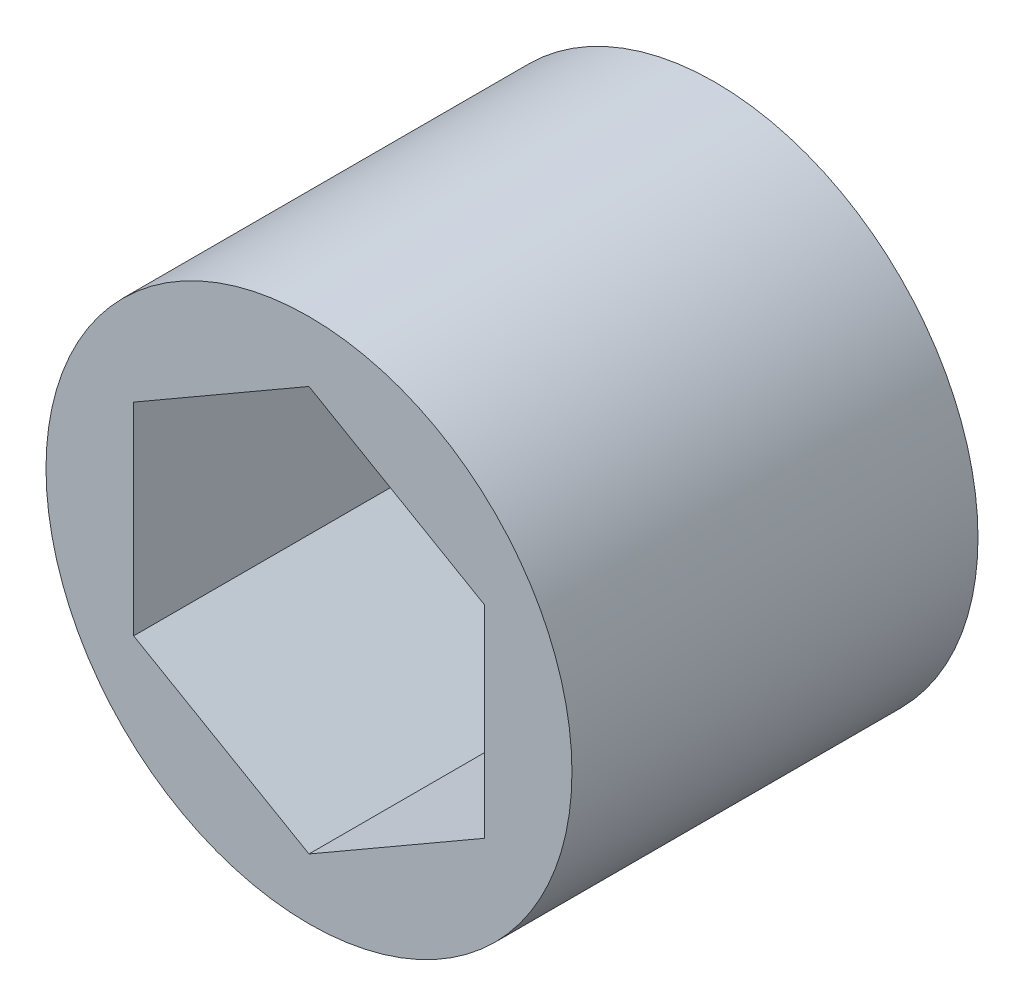
ISO-10303-21;
HEADER;
FILE_DESCRIPTION(('STEP AP214'),'2;1');
FILE_NAME('part.step','',(''),(''),'','','');
FILE_SCHEMA(('AUTOMOTIVE_DESIGN { 1 0 10303 214 1 1 1 1 }'));
ENDSEC;
DATA;
#1=APPLICATION_CONTEXT('core data for automotive mechanical design processes');
#2=APPLICATION_PROTOCOL_DEFINITION('international standard','automotive_design',2000,#1);
#3=PRODUCT_CONTEXT('',#1,'mechanical');
#4=PRODUCT('Part','Part','',(#3));
#5=PRODUCT_RELATED_PRODUCT_CATEGORY('part','',(#4));
#6=PRODUCT_DEFINITION_FORMATION('','',#4);
#7=PRODUCT_DEFINITION_CONTEXT('part definition',#1,'design');
#8=PRODUCT_DEFINITION('design','',#6,#7);
#9=PRODUCT_DEFINITION_SHAPE('','',#8);
#10=(LENGTH_UNIT() NAMED_UNIT(*) SI_UNIT(.MILLI.,.METRE.));
#11=(NAMED_UNIT(*) PLANE_ANGLE_UNIT() SI_UNIT($,.RADIAN.));
#12=(NAMED_UNIT(*) SI_UNIT($,.STERADIAN.) SOLID_ANGLE_UNIT());
#13=UNCERTAINTY_MEASURE_WITH_UNIT(LENGTH_MEASURE(1.E-05),#10,'distance_accuracy_value','');
#14=(GEOMETRIC_REPRESENTATION_CONTEXT(3) GLOBAL_UNCERTAINTY_ASSIGNED_CONTEXT((#13)) GLOBAL_UNIT_ASSIGNED_CONTEXT((#10,
#11,#12)) REPRESENTATION_CONTEXT('',''));
#15=CARTESIAN_POINT('',(0.,0.,0.));
#16=DIRECTION('',(0.,0.,1.));
#17=DIRECTION('',(1.,0.,0.));
#18=AXIS2_PLACEMENT_3D('',#15,#16,#17);
#19=CARTESIAN_POINT('',(0.,0.,7.3533));
#20=DIRECTION('',(0.,0.,1.));
#21=DIRECTION('',(1.,0.,0.));
#22=AXIS2_PLACEMENT_3D('',#19,#20,#21);
#23=PLANE('',#22);
#24=CARTESIAN_POINT('',(0.,0.,7.3533));
#25=DIRECTION('',(0.,0.,1.));
#26=DIRECTION('',(1.,0.,0.));
#27=AXIS2_PLACEMENT_3D('',#24,#25,#26);
#28=CIRCLE('',#27,9.525);
#29=CARTESIAN_POINT('',(-9.525,0.,7.3533));
#30=VERTEX_POINT('',#29);
#31=EDGE_CURVE('E11',#30,#30,#28,.T.);
#32=ORIENTED_EDGE('',*,*,#31,.T.);
#33=EDGE_LOOP('',(#32));
#34=FACE_BOUND('',#33,.T.);
#35=DIRECTION('',(-0.866025403784439,-0.5,0.));
#36=VECTOR('',#35,1.);
#37=CARTESIAN_POINT('',(0.,7.33234841870824,7.3533));
#38=LINE('',#37,#36);
#39=CARTESIAN_POINT('',(0.,7.33234841870824,7.3533));
#40=VERTEX_POINT('',#39);
#41=CARTESIAN_POINT('',(-6.35,3.66617420935412,7.3533));
#42=VERTEX_POINT('',#41);
#43=EDGE_CURVE('E104',#40,#42,#38,.T.);
#44=ORIENTED_EDGE('',*,*,#43,.F.);
#45=DIRECTION('',(-0.866025403784439,0.5,0.));
#46=VECTOR('',#45,1.);
#47=CARTESIAN_POINT('',(6.35,3.66617420935412,7.3533));
#48=LINE('',#47,#46);
#49=CARTESIAN_POINT('',(6.35,3.66617420935412,7.3533));
#50=VERTEX_POINT('',#49);
#51=EDGE_CURVE('E96',#50,#40,#48,.T.);
#52=ORIENTED_EDGE('',*,*,#51,.F.);
#53=DIRECTION('',(0.,1.,0.));
#54=VECTOR('',#53,1.);
#55=CARTESIAN_POINT('',(6.35,-3.66617420935413,7.3533));
#56=LINE('',#55,#54);
#57=CARTESIAN_POINT('',(6.35,-3.66617420935413,7.3533));
#58=VERTEX_POINT('',#57);
#59=EDGE_CURVE('E124',#58,#50,#56,.T.);
#60=ORIENTED_EDGE('',*,*,#59,.F.);
#61=DIRECTION('',(0.866025403784439,0.5,0.));
#62=VECTOR('',#61,1.);
#63=CARTESIAN_POINT('',(0.,-7.33234841870825,7.3533));
#64=LINE('',#63,#62);
#65=CARTESIAN_POINT('',(0.,-7.33234841870825,7.3533));
#66=VERTEX_POINT('',#65);
#67=EDGE_CURVE('E122',#66,#58,#64,.T.);
#68=ORIENTED_EDGE('',*,*,#67,.F.);
#69=DIRECTION('',(0.866025403784439,-0.5,0.));
#70=VECTOR('',#69,1.);
#71=CARTESIAN_POINT('',(-6.35,-3.66617420935412,7.3533));
#72=LINE('',#71,#70);
#73=CARTESIAN_POINT('',(-6.35,-3.66617420935412,7.3533));
#74=VERTEX_POINT('',#73);
#75=EDGE_CURVE('E118',#74,#66,#72,.T.);
#76=ORIENTED_EDGE('',*,*,#75,.F.);
#77=DIRECTION('',(0.,-1.,0.));
#78=VECTOR('',#77,1.);
#79=CARTESIAN_POINT('',(-6.35,3.66617420935412,7.3533));
#80=LINE('',#79,#78);
#81=EDGE_CURVE('E116',#42,#74,#80,.T.);
#82=ORIENTED_EDGE('',*,*,#81,.F.);
#83=EDGE_LOOP('',(#44,#52,#60,#68,#76,#82));
#84=FACE_BOUND('',#83,.T.);
#85=ADVANCED_FACE('F43',(#34,#84),#23,.T.);
#86=CARTESIAN_POINT('',(0.,0.,-7.3533));
#87=DIRECTION('',(0.,0.,1.));
#88=DIRECTION('',(1.,0.,0.));
#89=AXIS2_PLACEMENT_3D('',#86,#87,#88);
#90=PLANE('',#89);
#91=CARTESIAN_POINT('',(0.,0.,-7.3533));
#92=DIRECTION('',(0.,0.,1.));
#93=DIRECTION('',(1.,0.,0.));
#94=AXIS2_PLACEMENT_3D('',#91,#92,#93);
#95=CIRCLE('',#94,9.525);
#96=CARTESIAN_POINT('',(-9.525,0.,-7.3533));
#97=VERTEX_POINT('',#96);
#98=EDGE_CURVE('E47',#97,#97,#95,.T.);
#99=ORIENTED_EDGE('',*,*,#98,.F.);
#100=EDGE_LOOP('',(#99));
#101=FACE_BOUND('',#100,.T.);
#102=DIRECTION('',(-0.866025403784439,0.5,0.));
#103=VECTOR('',#102,1.);
#104=CARTESIAN_POINT('',(6.35,3.66617420935412,-7.3533));
#105=LINE('',#104,#103);
#106=CARTESIAN_POINT('',(6.35,3.66617420935412,-7.3533));
#107=VERTEX_POINT('',#106);
#108=CARTESIAN_POINT('',(0.,7.33234841870824,-7.3533));
#109=VERTEX_POINT('',#108);
#110=EDGE_CURVE('E66',#107,#109,#105,.T.);
#111=ORIENTED_EDGE('',*,*,#110,.T.);
#112=DIRECTION('',(-0.866025403784439,-0.5,0.));
#113=VECTOR('',#112,1.);
#114=CARTESIAN_POINT('',(0.,7.33234841870824,-7.3533));
#115=LINE('',#114,#113);
#116=CARTESIAN_POINT('',(-6.35,3.66617420935412,-7.3533));
#117=VERTEX_POINT('',#116);
#118=EDGE_CURVE('E111',#109,#117,#115,.T.);
#119=ORIENTED_EDGE('',*,*,#118,.T.);
#120=DIRECTION('',(0.,-1.,0.));
#121=VECTOR('',#120,1.);
#122=CARTESIAN_POINT('',(-6.35,3.66617420935412,-7.3533));
#123=LINE('',#122,#121);
#124=CARTESIAN_POINT('',(-6.35,-3.66617420935412,-7.3533));
#125=VERTEX_POINT('',#124);
#126=EDGE_CURVE('E128',#117,#125,#123,.T.);
#127=ORIENTED_EDGE('',*,*,#126,.T.);
#128=DIRECTION('',(0.866025403784439,-0.5,0.));
#129=VECTOR('',#128,1.);
#130=CARTESIAN_POINT('',(-6.35,-3.66617420935412,-7.3533));
#131=LINE('',#130,#129);
#132=CARTESIAN_POINT('',(0.,-7.33234841870825,-7.3533));
#133=VERTEX_POINT('',#132);
#134=EDGE_CURVE('E131',#125,#133,#131,.T.);
#135=ORIENTED_EDGE('',*,*,#134,.T.);
#136=DIRECTION('',(0.866025403784439,0.5,0.));
#137=VECTOR('',#136,1.);
#138=CARTESIAN_POINT('',(0.,-7.33234841870825,-7.3533));
#139=LINE('',#138,#137);
#140=CARTESIAN_POINT('',(6.35,-3.66617420935413,-7.3533));
#141=VERTEX_POINT('',#140);
#142=EDGE_CURVE('E134',#133,#141,#139,.T.);
#143=ORIENTED_EDGE('',*,*,#142,.T.);
#144=DIRECTION('',(0.,1.,0.));
#145=VECTOR('',#144,1.);
#146=CARTESIAN_POINT('',(6.35,-3.66617420935413,-7.3533));
#147=LINE('',#146,#145);
#148=EDGE_CURVE('E105',#141,#107,#147,.T.);
#149=ORIENTED_EDGE('',*,*,#148,.T.);
#150=EDGE_LOOP('',(#111,#119,#127,#135,#143,#149));
#151=FACE_BOUND('',#150,.T.);
#152=ADVANCED_FACE('F151',(#101,#151),#90,.F.);
#153=CARTESIAN_POINT('',(0.,0.,7.3533));
#154=DIRECTION('',(0.,0.,-1.));
#155=DIRECTION('',(-1.,0.,0.));
#156=AXIS2_PLACEMENT_3D('',#153,#154,#155);
#157=CYLINDRICAL_SURFACE('',#156,9.525);
#158=CARTESIAN_POINT('',(-9.525,0.,7.3533));
#159=CARTESIAN_POINT('',(-9.525,0.,7.20010625));
#160=CARTESIAN_POINT('',(-9.525,0.,7.0469125));
#161=CARTESIAN_POINT('',(-9.525,0.,6.740525));
#162=CARTESIAN_POINT('',(-9.525,0.,6.58733125));
#163=CARTESIAN_POINT('',(-9.525,0.,6.28094375));
#164=CARTESIAN_POINT('',(-9.525,0.,6.12775));
#165=CARTESIAN_POINT('',(-9.525,0.,5.8213625));
#166=CARTESIAN_POINT('',(-9.525,0.,5.66816875));
#167=CARTESIAN_POINT('',(-9.525,0.,5.36178125));
#168=CARTESIAN_POINT('',(-9.525,0.,5.2085875));
#169=CARTESIAN_POINT('',(-9.525,0.,4.9022));
#170=CARTESIAN_POINT('',(-9.525,0.,4.74900625));
#171=CARTESIAN_POINT('',(-9.525,0.,4.44261875));
#172=CARTESIAN_POINT('',(-9.525,0.,4.289425));
#173=CARTESIAN_POINT('',(-9.525,0.,3.9830375));
#174=CARTESIAN_POINT('',(-9.525,0.,3.82984375));
#175=CARTESIAN_POINT('',(-9.525,0.,3.52345625));
#176=CARTESIAN_POINT('',(-9.525,0.,3.3702625));
#177=CARTESIAN_POINT('',(-9.525,0.,3.063875));
#178=CARTESIAN_POINT('',(-9.525,0.,2.91068125));
#179=CARTESIAN_POINT('',(-9.525,0.,2.60429375));
#180=CARTESIAN_POINT('',(-9.525,0.,2.4511));
#181=CARTESIAN_POINT('',(-9.525,0.,2.1447125));
#182=CARTESIAN_POINT('',(-9.525,0.,1.99151875));
#183=CARTESIAN_POINT('',(-9.525,0.,1.68513125));
#184=CARTESIAN_POINT('',(-9.525,0.,1.5319375));
#185=CARTESIAN_POINT('',(-9.525,0.,1.22555));
#186=CARTESIAN_POINT('',(-9.525,0.,1.07235625));
#187=CARTESIAN_POINT('',(-9.525,0.,0.765968749999999));
#188=CARTESIAN_POINT('',(-9.525,0.,0.612774999999999));
#189=CARTESIAN_POINT('',(-9.525,0.,0.306387499999999));
#190=CARTESIAN_POINT('',(-9.525,0.,0.153193749999999));
#191=CARTESIAN_POINT('',(-9.525,0.,-0.15319375));
#192=CARTESIAN_POINT('',(-9.525,0.,-0.3063875));
#193=CARTESIAN_POINT('',(-9.525,0.,-0.612775));
#194=CARTESIAN_POINT('',(-9.525,0.,-0.76596875));
#195=CARTESIAN_POINT('',(-9.525,0.,-1.07235625));
#196=CARTESIAN_POINT('',(-9.525,0.,-1.22555));
#197=CARTESIAN_POINT('',(-9.525,0.,-1.5319375));
#198=CARTESIAN_POINT('',(-9.525,0.,-1.68513125));
#199=CARTESIAN_POINT('',(-9.525,0.,-1.99151875));
#200=CARTESIAN_POINT('',(-9.525,0.,-2.1447125));
#201=CARTESIAN_POINT('',(-9.525,0.,-2.4511));
#202=CARTESIAN_POINT('',(-9.525,0.,-2.60429375));
#203=CARTESIAN_POINT('',(-9.525,0.,-2.91068125));
#204=CARTESIAN_POINT('',(-9.525,0.,-3.063875));
#205=CARTESIAN_POINT('',(-9.525,0.,-3.3702625));
#206=CARTESIAN_POINT('',(-9.525,0.,-3.52345625));
#207=CARTESIAN_POINT('',(-9.525,0.,-3.82984375));
#208=CARTESIAN_POINT('',(-9.525,0.,-3.9830375));
#209=CARTESIAN_POINT('',(-9.525,0.,-4.289425));
#210=CARTESIAN_POINT('',(-9.525,0.,-4.44261875));
#211=CARTESIAN_POINT('',(-9.525,0.,-4.74900625));
#212=CARTESIAN_POINT('',(-9.525,0.,-4.9022));
#213=CARTESIAN_POINT('',(-9.525,0.,-5.2085875));
#214=CARTESIAN_POINT('',(-9.525,0.,-5.36178125));
#215=CARTESIAN_POINT('',(-9.525,0.,-5.66816875));
#216=CARTESIAN_POINT('',(-9.525,0.,-5.8213625));
#217=CARTESIAN_POINT('',(-9.525,0.,-6.12775));
#218=CARTESIAN_POINT('',(-9.525,0.,-6.28094375));
#219=CARTESIAN_POINT('',(-9.525,0.,-6.58733125));
#220=CARTESIAN_POINT('',(-9.525,0.,-6.740525));
#221=CARTESIAN_POINT('',(-9.525,0.,-7.0469125));
#222=CARTESIAN_POINT('',(-9.525,0.,-7.20010625));
#223=CARTESIAN_POINT('',(-9.525,0.,-7.3533));
#224=B_SPLINE_CURVE_WITH_KNOTS('',3,(#158,#159,#160,#161,#162,#163,#164,#165,#166,#167,#168,
#169,#170,#171,#172,#173,#174,#175,#176,#177,#178,#179,#180,#181,#182,#183,#184,#185,#186,#187,
#188,#189,#190,#191,#192,#193,#194,#195,#196,#197,#198,#199,#200,#201,#202,#203,#204,#205,#206,
#207,#208,#209,#210,#211,#212,#213,#214,#215,#216,#217,#218,#219,#220,#221,#222,#223),
.UNSPECIFIED.,.F.,.F.,(4,2,2,2,2,2,2,2,2,2,2,2,2,2,2,2,2,2,2,2,2,2,2,2,2,2,2,2,2,2,2,2,4),(0.,
0.45958125,0.919162499999999,1.37874375,1.838325,2.29790625,2.7574875,3.21706875,3.67665,
4.13623125,4.5958125,5.05539375,5.514975,5.97455625,6.4341375,6.89371875,7.3533,7.81288125,
8.2724625,8.73204375,9.191625,9.65120625,10.1107875,10.57036875,11.02995,11.48953125,11.9491125,
12.40869375,12.868275,13.32785625,13.7874375,14.24701875,14.7066),.UNSPECIFIED.);
#225=EDGE_CURVE('BSEAM45',#30,#97,#224,.T.);
#226=ORIENTED_EDGE('',*,*,#31,.F.);
#227=ORIENTED_EDGE('',*,*,#98,.T.);
#228=ORIENTED_EDGE('',*,*,#225,.T.);
#229=ORIENTED_EDGE('',*,*,#225,.F.);
#230=EDGE_LOOP('',(#226,#228,#227,#229));
#231=FACE_BOUND('',#230,.T.);
#232=ADVANCED_FACE('F45',(#231),#157,.T.);
#233=CARTESIAN_POINT('',(6.35,3.66617420935412,7.3533));
#234=DIRECTION('',(-0.5,-0.866025403784439,0.));
#235=DIRECTION('',(0.866025403784439,-0.5,0.));
#236=AXIS2_PLACEMENT_3D('',#233,#234,#235);
#237=PLANE('',#236);
#238=ORIENTED_EDGE('',*,*,#110,.F.);
#239=DIRECTION('',(0.,0.,-1.));
#240=VECTOR('',#239,1.);
#241=CARTESIAN_POINT('',(6.35,3.66617420935412,7.3533));
#242=LINE('',#241,#240);
#243=EDGE_CURVE('E100',#50,#107,#242,.T.);
#244=ORIENTED_EDGE('',*,*,#243,.F.);
#245=ORIENTED_EDGE('',*,*,#51,.T.);
#246=DIRECTION('',(0.,0.,-1.));
#247=VECTOR('',#246,1.);
#248=CARTESIAN_POINT('',(0.,7.33234841870824,7.3533));
#249=LINE('',#248,#247);
#250=EDGE_CURVE('E99',#40,#109,#249,.T.);
#251=ORIENTED_EDGE('',*,*,#250,.T.);
#252=EDGE_LOOP('',(#238,#244,#245,#251));
#253=FACE_BOUND('',#252,.T.);
#254=ADVANCED_FACE('F98',(#253),#237,.T.);
#255=CARTESIAN_POINT('',(0.,7.33234841870824,7.3533));
#256=DIRECTION('',(0.5,-0.866025403784439,0.));
#257=DIRECTION('',(0.866025403784439,0.5,0.));
#258=AXIS2_PLACEMENT_3D('',#255,#256,#257);
#259=PLANE('',#258);
#260=ORIENTED_EDGE('',*,*,#118,.F.);
#261=ORIENTED_EDGE('',*,*,#250,.F.);
#262=ORIENTED_EDGE('',*,*,#43,.T.);
#263=DIRECTION('',(0.,0.,-1.));
#264=VECTOR('',#263,1.);
#265=CARTESIAN_POINT('',(-6.35,3.66617420935412,7.3533));
#266=LINE('',#265,#264);
#267=EDGE_CURVE('E112',#42,#117,#266,.T.);
#268=ORIENTED_EDGE('',*,*,#267,.T.);
#269=EDGE_LOOP('',(#260,#261,#262,#268));
#270=FACE_BOUND('',#269,.T.);
#271=ADVANCED_FACE('F108',(#270),#259,.T.);
#272=CARTESIAN_POINT('',(-6.35,3.66617420935412,7.3533));
#273=DIRECTION('',(1.,0.,0.));
#274=DIRECTION('',(0.,1.,0.));
#275=AXIS2_PLACEMENT_3D('',#272,#273,#274);
#276=PLANE('',#275);
#277=ORIENTED_EDGE('',*,*,#126,.F.);
#278=ORIENTED_EDGE('',*,*,#267,.F.);
#279=ORIENTED_EDGE('',*,*,#81,.T.);
#280=DIRECTION('',(0.,0.,-1.));
#281=VECTOR('',#280,1.);
#282=CARTESIAN_POINT('',(-6.35,-3.66617420935412,7.3533));
#283=LINE('',#282,#281);
#284=EDGE_CURVE('E143',#74,#125,#283,.T.);
#285=ORIENTED_EDGE('',*,*,#284,.T.);
#286=EDGE_LOOP('',(#277,#278,#279,#285));
#287=FACE_BOUND('',#286,.T.);
#288=ADVANCED_FACE('F147',(#287),#276,.T.);
#289=CARTESIAN_POINT('',(-6.35,-3.66617420935412,7.3533));
#290=DIRECTION('',(0.5,0.866025403784439,0.));
#291=DIRECTION('',(-0.866025403784439,0.5,0.));
#292=AXIS2_PLACEMENT_3D('',#289,#290,#291);
#293=PLANE('',#292);
#294=ORIENTED_EDGE('',*,*,#134,.F.);
#295=ORIENTED_EDGE('',*,*,#284,.F.);
#296=ORIENTED_EDGE('',*,*,#75,.T.);
#297=DIRECTION('',(0.,0.,-1.));
#298=VECTOR('',#297,1.);
#299=CARTESIAN_POINT('',(0.,-7.33234841870825,7.3533));
#300=LINE('',#299,#298);
#301=EDGE_CURVE('E141',#66,#133,#300,.T.);
#302=ORIENTED_EDGE('',*,*,#301,.T.);
#303=EDGE_LOOP('',(#294,#295,#296,#302));
#304=FACE_BOUND('',#303,.T.);
#305=ADVANCED_FACE('F159',(#304),#293,.T.);
#306=CARTESIAN_POINT('',(0.,-7.33234841870825,7.3533));
#307=DIRECTION('',(-0.5,0.866025403784439,0.));
#308=DIRECTION('',(-0.866025403784439,-0.5,0.));
#309=AXIS2_PLACEMENT_3D('',#306,#307,#308);
#310=PLANE('',#309);
#311=ORIENTED_EDGE('',*,*,#142,.F.);
#312=ORIENTED_EDGE('',*,*,#301,.F.);
#313=ORIENTED_EDGE('',*,*,#67,.T.);
#314=DIRECTION('',(0.,0.,-1.));
#315=VECTOR('',#314,1.);
#316=CARTESIAN_POINT('',(6.35,-3.66617420935413,7.3533));
#317=LINE('',#316,#315);
#318=EDGE_CURVE('E58',#58,#141,#317,.T.);
#319=ORIENTED_EDGE('',*,*,#318,.T.);
#320=EDGE_LOOP('',(#311,#312,#313,#319));
#321=FACE_BOUND('',#320,.T.);
#322=ADVANCED_FACE('F157',(#321),#310,.T.);
#323=CARTESIAN_POINT('',(6.35,-3.66617420935413,7.3533));
#324=DIRECTION('',(-1.,0.,0.));
#325=DIRECTION('',(0.,0.,1.));
#326=AXIS2_PLACEMENT_3D('',#323,#324,#325);
#327=PLANE('',#326);
#328=ORIENTED_EDGE('',*,*,#148,.F.);
#329=ORIENTED_EDGE('',*,*,#318,.F.);
#330=ORIENTED_EDGE('',*,*,#59,.T.);
#331=ORIENTED_EDGE('',*,*,#243,.T.);
#332=EDGE_LOOP('',(#328,#329,#330,#331));
#333=FACE_BOUND('',#332,.T.);
#334=ADVANCED_FACE('F153',(#333),#327,.T.);
#335=CLOSED_SHELL('',(#85,#152,#232,#254,#271,#288,#305,#322,#334));
#336=MANIFOLD_SOLID_BREP('B2',#335);
#337=ADVANCED_BREP_SHAPE_REPRESENTATION('',(#18,#336),#14);
#338=SHAPE_DEFINITION_REPRESENTATION(#9,#337);
ENDSEC;
END-ISO-10303-21;
